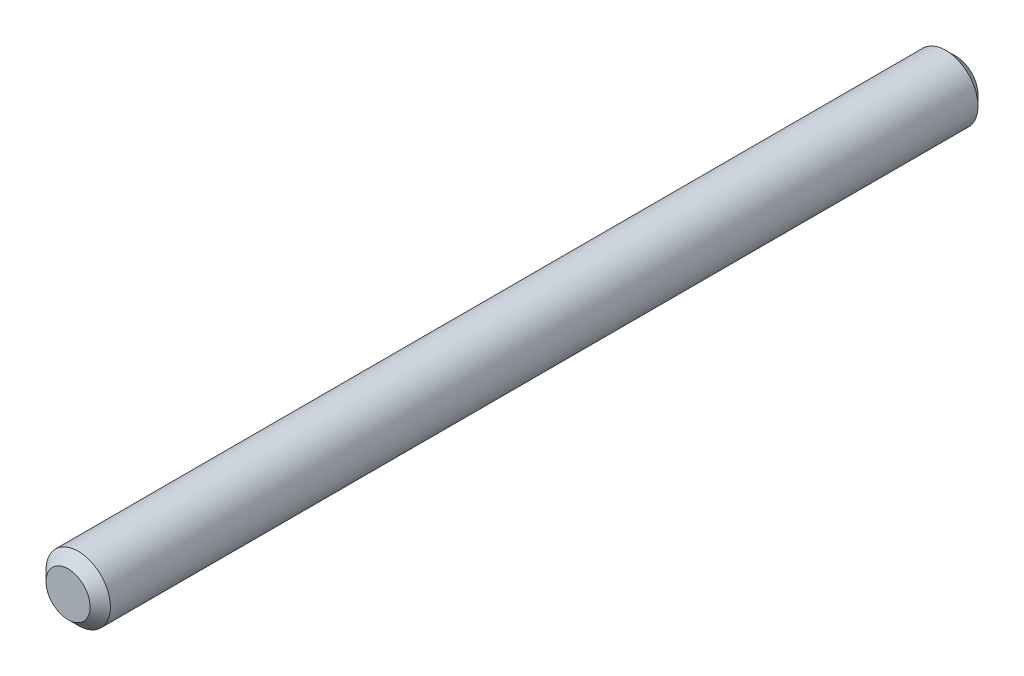
ISO-10303-21;
HEADER;
FILE_DESCRIPTION(('STEP AP214'),'2;1');
FILE_NAME('part.step','',(''),(''),'','','');
FILE_SCHEMA(('AUTOMOTIVE_DESIGN { 1 0 10303 214 1 1 1 1 }'));
ENDSEC;
DATA;
#1=APPLICATION_CONTEXT('core data for automotive mechanical design processes');
#2=APPLICATION_PROTOCOL_DEFINITION('international standard','automotive_design',2000,#1);
#3=PRODUCT_CONTEXT('',#1,'mechanical');
#4=PRODUCT('Part','Part','',(#3));
#5=PRODUCT_RELATED_PRODUCT_CATEGORY('part','',(#4));
#6=PRODUCT_DEFINITION_FORMATION('','',#4);
#7=PRODUCT_DEFINITION_CONTEXT('part definition',#1,'design');
#8=PRODUCT_DEFINITION('design','',#6,#7);
#9=PRODUCT_DEFINITION_SHAPE('','',#8);
#10=(LENGTH_UNIT() NAMED_UNIT(*) SI_UNIT(.MILLI.,.METRE.));
#11=(NAMED_UNIT(*) PLANE_ANGLE_UNIT() SI_UNIT($,.RADIAN.));
#12=(NAMED_UNIT(*) SI_UNIT($,.STERADIAN.) SOLID_ANGLE_UNIT());
#13=UNCERTAINTY_MEASURE_WITH_UNIT(LENGTH_MEASURE(1.E-05),#10,'distance_accuracy_value','');
#14=(GEOMETRIC_REPRESENTATION_CONTEXT(3) GLOBAL_UNCERTAINTY_ASSIGNED_CONTEXT((#13)) GLOBAL_UNIT_ASSIGNED_CONTEXT((#10,
#11,#12)) REPRESENTATION_CONTEXT('',''));
#15=CARTESIAN_POINT('',(0.,0.,0.));
#16=DIRECTION('',(0.,0.,1.));
#17=DIRECTION('',(1.,0.,0.));
#18=AXIS2_PLACEMENT_3D('',#15,#16,#17);
#19=CARTESIAN_POINT('',(0.,0.,-87.5));
#20=DIRECTION('',(0.,0.,1.));
#21=DIRECTION('',(1.,0.,0.));
#22=AXIS2_PLACEMENT_3D('',#19,#20,#21);
#23=CYLINDRICAL_SURFACE('',#22,3.175);
#24=CARTESIAN_POINT('',(0.,0.,-86.5));
#25=DIRECTION('',(0.,0.,1.));
#26=DIRECTION('',(1.,0.,0.));
#27=AXIS2_PLACEMENT_3D('',#24,#25,#26);
#28=CIRCLE('',#27,3.175);
#29=CARTESIAN_POINT('',(3.175,0.,-86.5));
#30=VERTEX_POINT('',#29);
#31=EDGE_CURVE('E52',#30,#30,#28,.T.);
#32=ORIENTED_EDGE('',*,*,#31,.T.);
#33=EDGE_LOOP('',(#32));
#34=FACE_BOUND('',#33,.T.);
#35=CARTESIAN_POINT('',(0.,0.,-1.));
#36=DIRECTION('',(0.,0.,1.));
#37=DIRECTION('',(1.,0.,0.));
#38=AXIS2_PLACEMENT_3D('',#35,#36,#37);
#39=CIRCLE('',#38,3.175);
#40=CARTESIAN_POINT('',(3.175,0.,-1.));
#41=VERTEX_POINT('',#40);
#42=EDGE_CURVE('E57',#41,#41,#39,.F.);
#43=ORIENTED_EDGE('',*,*,#42,.T.);
#44=EDGE_LOOP('',(#43));
#45=FACE_BOUND('',#44,.T.);
#46=ADVANCED_FACE('F39',(#34,#45),#23,.T.);
#47=CARTESIAN_POINT('',(0.,0.,-87.5));
#48=DIRECTION('',(0.,0.,1.));
#49=DIRECTION('',(1.,0.,0.));
#50=AXIS2_PLACEMENT_3D('',#47,#48,#49);
#51=PLANE('',#50);
#52=CARTESIAN_POINT('',(0.,0.,-87.5));
#53=DIRECTION('',(0.,0.,1.));
#54=DIRECTION('',(1.,0.,0.));
#55=AXIS2_PLACEMENT_3D('',#52,#53,#54);
#56=CIRCLE('',#55,2.17500000000001);
#57=CARTESIAN_POINT('',(2.17500000000001,0.,-87.5));
#58=VERTEX_POINT('',#57);
#59=EDGE_CURVE('E47',#58,#58,#56,.F.);
#60=ORIENTED_EDGE('',*,*,#59,.T.);
#61=EDGE_LOOP('',(#60));
#62=FACE_BOUND('',#61,.T.);
#63=ADVANCED_FACE('F74',(#62),#51,.F.);
#64=CARTESIAN_POINT('',(0.,0.,0.));
#65=DIRECTION('',(0.,0.,1.));
#66=DIRECTION('',(1.,0.,0.));
#67=AXIS2_PLACEMENT_3D('',#64,#65,#66);
#68=PLANE('',#67);
#69=CARTESIAN_POINT('',(0.,0.,0.));
#70=DIRECTION('',(0.,0.,1.));
#71=DIRECTION('',(1.,0.,0.));
#72=AXIS2_PLACEMENT_3D('',#69,#70,#71);
#73=CIRCLE('',#72,2.17500000000001);
#74=CARTESIAN_POINT('',(2.17500000000001,0.,0.));
#75=VERTEX_POINT('',#74);
#76=EDGE_CURVE('E10',#75,#75,#73,.T.);
#77=ORIENTED_EDGE('',*,*,#76,.T.);
#78=EDGE_LOOP('',(#77));
#79=FACE_BOUND('',#78,.T.);
#80=ADVANCED_FACE('F71',(#79),#68,.T.);
#81=CARTESIAN_POINT('',(0.,0.,-86.5));
#82=DIRECTION('',(0.,0.,1.));
#83=DIRECTION('',(1.,0.,0.));
#84=AXIS2_PLACEMENT_3D('',#81,#82,#83);
#85=CONICAL_SURFACE('',#84,3.175,0.785398163397443);
#86=ORIENTED_EDGE('',*,*,#59,.F.);
#87=EDGE_LOOP('',(#86));
#88=FACE_BOUND('',#87,.T.);
#89=ORIENTED_EDGE('',*,*,#31,.F.);
#90=EDGE_LOOP('',(#89));
#91=FACE_BOUND('',#90,.T.);
#92=ADVANCED_FACE('F67',(#88,#91),#85,.T.);
#93=CARTESIAN_POINT('',(0.,0.,0.));
#94=DIRECTION('',(0.,0.,-1.));
#95=DIRECTION('',(-1.,0.,0.));
#96=AXIS2_PLACEMENT_3D('',#93,#94,#95);
#97=CONICAL_SURFACE('',#96,2.17500000000001,0.785398163397443);
#98=ORIENTED_EDGE('',*,*,#42,.F.);
#99=EDGE_LOOP('',(#98));
#100=FACE_BOUND('',#99,.T.);
#101=ORIENTED_EDGE('',*,*,#76,.F.);
#102=EDGE_LOOP('',(#101));
#103=FACE_BOUND('',#102,.T.);
#104=ADVANCED_FACE('F41',(#100,#103),#97,.T.);
#105=CLOSED_SHELL('',(#46,#63,#80,#92,#104));
#106=MANIFOLD_SOLID_BREP('B2',#105);
#107=ADVANCED_BREP_SHAPE_REPRESENTATION('',(#18,#106),#14);
#108=SHAPE_DEFINITION_REPRESENTATION(#9,#107);
ENDSEC;
END-ISO-10303-21;
